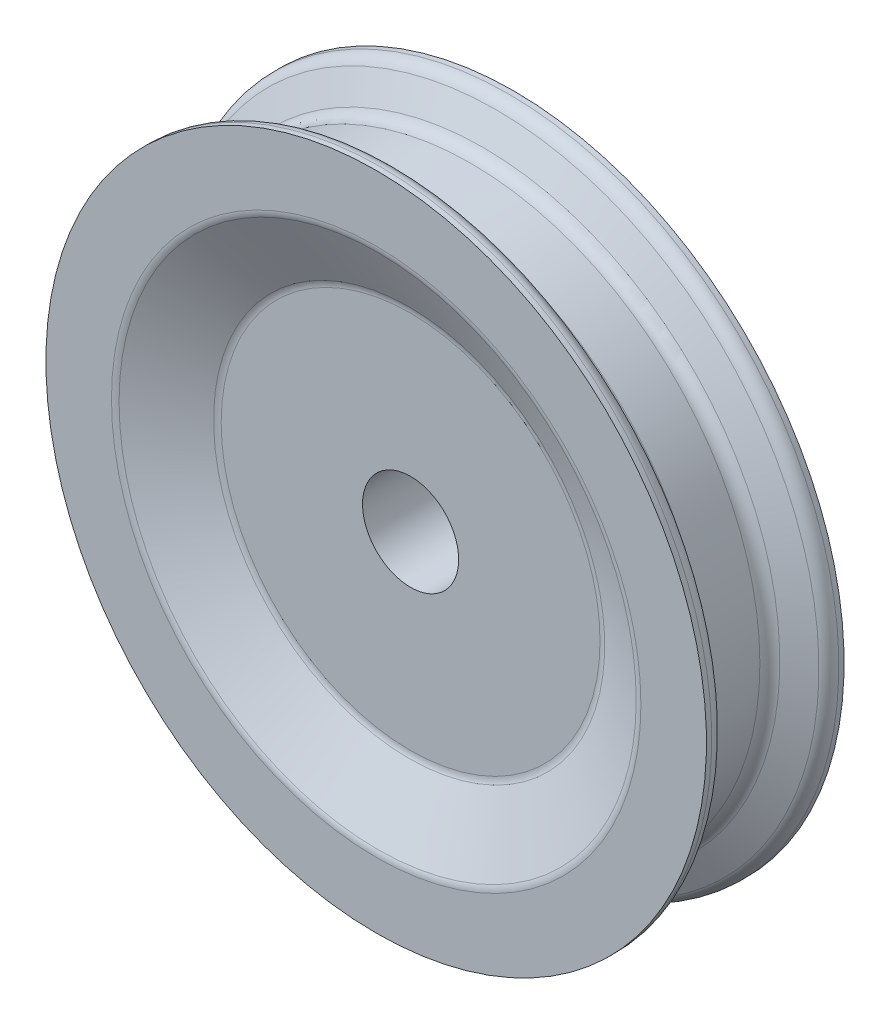
ISO-10303-21;
HEADER;
FILE_DESCRIPTION(('STEP AP214'),'2;1');
FILE_NAME('part.step','',(''),(''),'','','');
FILE_SCHEMA(('AUTOMOTIVE_DESIGN { 1 0 10303 214 1 1 1 1 }'));
ENDSEC;
DATA;
#1=APPLICATION_CONTEXT('core data for automotive mechanical design processes');
#2=APPLICATION_PROTOCOL_DEFINITION('international standard','automotive_design',2000,#1);
#3=PRODUCT_CONTEXT('',#1,'mechanical');
#4=PRODUCT('Part','Part','',(#3));
#5=PRODUCT_RELATED_PRODUCT_CATEGORY('part','',(#4));
#6=PRODUCT_DEFINITION_FORMATION('','',#4);
#7=PRODUCT_DEFINITION_CONTEXT('part definition',#1,'design');
#8=PRODUCT_DEFINITION('design','',#6,#7);
#9=PRODUCT_DEFINITION_SHAPE('','',#8);
#10=(LENGTH_UNIT() NAMED_UNIT(*) SI_UNIT(.MILLI.,.METRE.));
#11=(NAMED_UNIT(*) PLANE_ANGLE_UNIT() SI_UNIT($,.RADIAN.));
#12=(NAMED_UNIT(*) SI_UNIT($,.STERADIAN.) SOLID_ANGLE_UNIT());
#13=UNCERTAINTY_MEASURE_WITH_UNIT(LENGTH_MEASURE(1.E-05),#10,'distance_accuracy_value','');
#14=(GEOMETRIC_REPRESENTATION_CONTEXT(3) GLOBAL_UNCERTAINTY_ASSIGNED_CONTEXT((#13)) GLOBAL_UNIT_ASSIGNED_CONTEXT((#10,
#11,#12)) REPRESENTATION_CONTEXT('',''));
#15=CARTESIAN_POINT('',(0.,0.,0.));
#16=DIRECTION('',(0.,0.,1.));
#17=DIRECTION('',(1.,0.,0.));
#18=AXIS2_PLACEMENT_3D('',#15,#16,#17);
#19=CARTESIAN_POINT('',(0.,0.,12.5));
#20=DIRECTION('',(0.,0.,1.));
#21=DIRECTION('',(0.,-1.,0.));
#22=AXIS2_PLACEMENT_3D('',#19,#20,#21);
#23=CYLINDRICAL_SURFACE('',#22,120.);
#24=CARTESIAN_POINT('',(0.,0.,23.0901699437493));
#25=DIRECTION('',(0.,0.,-1.));
#26=DIRECTION('',(0.,1.,0.));
#27=AXIS2_PLACEMENT_3D('',#24,#25,#26);
#28=CIRCLE('',#27,120.);
#29=CARTESIAN_POINT('',(0.,120.,23.0901699437493));
#30=VERTEX_POINT('',#29);
#31=EDGE_CURVE('E39',#30,#30,#28,.F.);
#32=ORIENTED_EDGE('',*,*,#31,.T.);
#33=EDGE_LOOP('',(#32));
#34=FACE_BOUND('',#33,.T.);
#35=CARTESIAN_POINT('',(0.,0.,24.9999999999998));
#36=DIRECTION('',(0.,0.,1.));
#37=DIRECTION('',(0.,-1.,0.));
#38=AXIS2_PLACEMENT_3D('',#35,#36,#37);
#39=CIRCLE('',#38,120.);
#40=CARTESIAN_POINT('',(0.,-120.,24.9999999999998));
#41=VERTEX_POINT('',#40);
#42=EDGE_CURVE('E87',#41,#41,#39,.T.);
#43=ORIENTED_EDGE('',*,*,#42,.F.);
#44=EDGE_LOOP('',(#43));
#45=FACE_BOUND('',#44,.T.);
#46=ADVANCED_FACE('F31',(#34,#45),#23,.T.);
#47=CARTESIAN_POINT('',(0.,120.,24.9999999999998));
#48=DIRECTION('',(0.,0.,-1.));
#49=DIRECTION('',(0.,1.,0.));
#50=AXIS2_PLACEMENT_3D('',#47,#48,#49);
#51=PLANE('',#50);
#52=CARTESIAN_POINT('',(0.,0.,24.9999999999998));
#53=DIRECTION('',(0.,0.,-1.));
#54=DIRECTION('',(0.,1.,0.));
#55=AXIS2_PLACEMENT_3D('',#52,#53,#54);
#56=CIRCLE('',#55,96.1803398874989);
#57=CARTESIAN_POINT('',(0.,96.1803398874989,24.9999999999998));
#58=VERTEX_POINT('',#57);
#59=EDGE_CURVE('E78',#58,#58,#56,.T.);
#60=ORIENTED_EDGE('',*,*,#59,.T.);
#61=EDGE_LOOP('',(#60));
#62=FACE_BOUND('',#61,.T.);
#63=ORIENTED_EDGE('',*,*,#42,.T.);
#64=EDGE_LOOP('',(#63));
#65=FACE_BOUND('',#64,.T.);
#66=ADVANCED_FACE('F114',(#62,#65),#51,.F.);
#67=CARTESIAN_POINT('',(0.,0.,24.9999999999998));
#68=DIRECTION('',(0.,0.,1.));
#69=DIRECTION('',(0.,-1.,0.));
#70=AXIS2_PLACEMENT_3D('',#67,#68,#69);
#71=CONICAL_SURFACE('',#70,95.,1.1071487177941);
#72=CARTESIAN_POINT('',(0.,0.,24.4721359549994));
#73=DIRECTION('',(0.,0.,-1.));
#74=DIRECTION('',(0.,1.,0.));
#75=AXIS2_PLACEMENT_3D('',#72,#73,#74);
#76=CIRCLE('',#75,93.9442719099992);
#77=CARTESIAN_POINT('',(0.,93.9442719099992,24.4721359549994));
#78=VERTEX_POINT('',#77);
#79=EDGE_CURVE('E81',#78,#78,#76,.F.);
#80=ORIENTED_EDGE('',*,*,#79,.T.);
#81=EDGE_LOOP('',(#80));
#82=FACE_BOUND('',#81,.T.);
#83=CARTESIAN_POINT('',(0.,0.,13.0278640450004));
#84=DIRECTION('',(0.,0.,1.));
#85=DIRECTION('',(0.,-1.,0.));
#86=AXIS2_PLACEMENT_3D('',#83,#84,#85);
#87=CIRCLE('',#86,71.0557280900008);
#88=CARTESIAN_POINT('',(0.,-71.0557280900008,13.0278640450004));
#89=VERTEX_POINT('',#88);
#90=EDGE_CURVE('E84',#89,#89,#87,.F.);
#91=ORIENTED_EDGE('',*,*,#90,.T.);
#92=EDGE_LOOP('',(#91));
#93=FACE_BOUND('',#92,.T.);
#94=ADVANCED_FACE('F120',(#82,#93),#71,.F.);
#95=CARTESIAN_POINT('',(0.,70.,12.5));
#96=DIRECTION('',(0.,0.,-1.));
#97=DIRECTION('',(0.,1.,0.));
#98=AXIS2_PLACEMENT_3D('',#95,#96,#97);
#99=PLANE('',#98);
#100=CARTESIAN_POINT('',(0.,0.,12.5));
#101=DIRECTION('',(0.,0.,-1.));
#102=DIRECTION('',(0.,1.,0.));
#103=AXIS2_PLACEMENT_3D('',#100,#101,#102);
#104=CIRCLE('',#103,17.4625);
#105=CARTESIAN_POINT('',(0.,17.4625,12.5));
#106=VERTEX_POINT('',#105);
#107=EDGE_CURVE('E93',#106,#106,#104,.T.);
#108=ORIENTED_EDGE('',*,*,#107,.T.);
#109=EDGE_LOOP('',(#108));
#110=FACE_BOUND('',#109,.T.);
#111=CARTESIAN_POINT('',(0.,0.,12.5));
#112=DIRECTION('',(0.,0.,-1.));
#113=DIRECTION('',(0.,1.,0.));
#114=AXIS2_PLACEMENT_3D('',#111,#112,#113);
#115=CIRCLE('',#114,68.8196601125011);
#116=CARTESIAN_POINT('',(0.,68.8196601125011,12.5));
#117=VERTEX_POINT('',#116);
#118=EDGE_CURVE('E75',#117,#117,#115,.F.);
#119=ORIENTED_EDGE('',*,*,#118,.T.);
#120=EDGE_LOOP('',(#119));
#121=FACE_BOUND('',#120,.T.);
#122=ADVANCED_FACE('F184',(#110,#121),#99,.F.);
#123=CARTESIAN_POINT('',(0.,70.,-12.5));
#124=DIRECTION('',(0.,0.,1.));
#125=DIRECTION('',(0.,-1.,0.));
#126=AXIS2_PLACEMENT_3D('',#123,#124,#125);
#127=PLANE('',#126);
#128=CARTESIAN_POINT('',(0.,0.,-12.5));
#129=DIRECTION('',(0.,0.,1.));
#130=DIRECTION('',(0.,-1.,0.));
#131=AXIS2_PLACEMENT_3D('',#128,#129,#130);
#132=CIRCLE('',#131,17.4625);
#133=CARTESIAN_POINT('',(0.,-17.4625,-12.5));
#134=VERTEX_POINT('',#133);
#135=EDGE_CURVE('E35',#134,#134,#132,.T.);
#136=ORIENTED_EDGE('',*,*,#135,.T.);
#137=EDGE_LOOP('',(#136));
#138=FACE_BOUND('',#137,.T.);
#139=CARTESIAN_POINT('',(0.,0.,-12.5));
#140=DIRECTION('',(0.,0.,1.));
#141=DIRECTION('',(0.,-1.,0.));
#142=AXIS2_PLACEMENT_3D('',#139,#140,#141);
#143=CIRCLE('',#142,68.8196601125011);
#144=CARTESIAN_POINT('',(0.,-68.8196601125011,-12.5));
#145=VERTEX_POINT('',#144);
#146=EDGE_CURVE('E63',#145,#145,#143,.F.);
#147=ORIENTED_EDGE('',*,*,#146,.T.);
#148=EDGE_LOOP('',(#147));
#149=FACE_BOUND('',#148,.T.);
#150=ADVANCED_FACE('F100',(#138,#149),#127,.F.);
#151=CARTESIAN_POINT('',(0.,0.,-12.5));
#152=DIRECTION('',(0.,0.,-1.));
#153=DIRECTION('',(0.,1.,0.));
#154=AXIS2_PLACEMENT_3D('',#151,#152,#153);
#155=CONICAL_SURFACE('',#154,70.,1.10714871779408);
#156=CARTESIAN_POINT('',(0.,0.,-24.4721359549998));
#157=DIRECTION('',(0.,0.,1.));
#158=DIRECTION('',(0.,-1.,0.));
#159=AXIS2_PLACEMENT_3D('',#156,#157,#158);
#160=CIRCLE('',#159,93.9442719099991);
#161=CARTESIAN_POINT('',(0.,-93.9442719099991,-24.4721359549998));
#162=VERTEX_POINT('',#161);
#163=EDGE_CURVE('E66',#162,#162,#160,.F.);
#164=ORIENTED_EDGE('',*,*,#163,.T.);
#165=EDGE_LOOP('',(#164));
#166=FACE_BOUND('',#165,.T.);
#167=CARTESIAN_POINT('',(0.,0.,-13.0278640450004));
#168=DIRECTION('',(0.,0.,-1.));
#169=DIRECTION('',(0.,1.,0.));
#170=AXIS2_PLACEMENT_3D('',#167,#168,#169);
#171=CIRCLE('',#170,71.0557280900009);
#172=CARTESIAN_POINT('',(0.,71.0557280900009,-13.0278640450004));
#173=VERTEX_POINT('',#172);
#174=EDGE_CURVE('E69',#173,#173,#171,.F.);
#175=ORIENTED_EDGE('',*,*,#174,.T.);
#176=EDGE_LOOP('',(#175));
#177=FACE_BOUND('',#176,.T.);
#178=ADVANCED_FACE('F177',(#166,#177),#155,.F.);
#179=CARTESIAN_POINT('',(0.,95.,-25.0000000000002));
#180=DIRECTION('',(0.,0.,1.));
#181=DIRECTION('',(0.,-1.,0.));
#182=AXIS2_PLACEMENT_3D('',#179,#180,#181);
#183=PLANE('',#182);
#184=CARTESIAN_POINT('',(0.,0.,-25.0000000000002));
#185=DIRECTION('',(0.,0.,1.));
#186=DIRECTION('',(0.,-1.,0.));
#187=AXIS2_PLACEMENT_3D('',#184,#185,#186);
#188=CIRCLE('',#187,96.180339887499);
#189=CARTESIAN_POINT('',(0.,-96.180339887499,-25.0000000000002));
#190=VERTEX_POINT('',#189);
#191=EDGE_CURVE('E72',#190,#190,#188,.T.);
#192=ORIENTED_EDGE('',*,*,#191,.T.);
#193=EDGE_LOOP('',(#192));
#194=FACE_BOUND('',#193,.T.);
#195=CARTESIAN_POINT('',(0.,0.,-25.0000000000002));
#196=DIRECTION('',(0.,0.,1.));
#197=DIRECTION('',(0.,-1.,0.));
#198=AXIS2_PLACEMENT_3D('',#195,#196,#197);
#199=CIRCLE('',#198,120.);
#200=CARTESIAN_POINT('',(0.,-120.,-25.0000000000002));
#201=VERTEX_POINT('',#200);
#202=EDGE_CURVE('E90',#201,#201,#199,.T.);
#203=ORIENTED_EDGE('',*,*,#202,.F.);
#204=EDGE_LOOP('',(#203));
#205=FACE_BOUND('',#204,.T.);
#206=ADVANCED_FACE('F174',(#194,#205),#183,.F.);
#207=CARTESIAN_POINT('',(0.,0.,12.5));
#208=DIRECTION('',(0.,0.,1.));
#209=DIRECTION('',(0.,-1.,0.));
#210=AXIS2_PLACEMENT_3D('',#207,#208,#209);
#211=CYLINDRICAL_SURFACE('',#210,120.);
#212=CARTESIAN_POINT('',(0.,0.,-23.0901699437496));
#213=DIRECTION('',(0.,0.,-1.));
#214=DIRECTION('',(0.,1.,0.));
#215=AXIS2_PLACEMENT_3D('',#212,#213,#214);
#216=CIRCLE('',#215,120.);
#217=CARTESIAN_POINT('',(0.,120.,-23.0901699437496));
#218=VERTEX_POINT('',#217);
#219=EDGE_CURVE('E10',#218,#218,#216,.T.);
#220=ORIENTED_EDGE('',*,*,#219,.T.);
#221=EDGE_LOOP('',(#220));
#222=FACE_BOUND('',#221,.T.);
#223=ORIENTED_EDGE('',*,*,#202,.T.);
#224=EDGE_LOOP('',(#223));
#225=FACE_BOUND('',#224,.T.);
#226=ADVANCED_FACE('F170',(#222,#225),#211,.T.);
#227=CARTESIAN_POINT('',(0.,0.,-20.0000000000002));
#228=DIRECTION('',(0.,0.,-1.));
#229=DIRECTION('',(0.,1.,0.));
#230=AXIS2_PLACEMENT_3D('',#227,#228,#229);
#231=CONICAL_SURFACE('',#230,120.,1.10714871779408);
#232=CARTESIAN_POINT('',(0.,0.,-13.8819660112501));
#233=DIRECTION('',(0.,0.,-1.));
#234=DIRECTION('',(0.,1.,0.));
#235=AXIS2_PLACEMENT_3D('',#232,#233,#234);
#236=CIRCLE('',#235,107.7639320225);
#237=CARTESIAN_POINT('',(0.,107.7639320225,-13.8819660112501));
#238=VERTEX_POINT('',#237);
#239=EDGE_CURVE('E43',#238,#238,#236,.T.);
#240=ORIENTED_EDGE('',*,*,#239,.T.);
#241=EDGE_LOOP('',(#240));
#242=FACE_BOUND('',#241,.T.);
#243=CARTESIAN_POINT('',(0.,0.,-18.6180339887501));
#244=DIRECTION('',(0.,0.,1.));
#245=DIRECTION('',(0.,-1.,0.));
#246=AXIS2_PLACEMENT_3D('',#243,#244,#245);
#247=CIRCLE('',#246,117.2360679775);
#248=CARTESIAN_POINT('',(0.,-117.2360679775,-18.6180339887501));
#249=VERTEX_POINT('',#248);
#250=EDGE_CURVE('E48',#249,#249,#247,.T.);
#251=ORIENTED_EDGE('',*,*,#250,.T.);
#252=EDGE_LOOP('',(#251));
#253=FACE_BOUND('',#252,.T.);
#254=ADVANCED_FACE('F164',(#242,#253),#231,.T.);
#255=CARTESIAN_POINT('',(0.,0.,12.5));
#256=DIRECTION('',(0.,0.,1.));
#257=DIRECTION('',(0.,-1.,0.));
#258=AXIS2_PLACEMENT_3D('',#255,#256,#257);
#259=CYLINDRICAL_SURFACE('',#258,105.);
#260=CARTESIAN_POINT('',(0.,0.,9.40983005625048));
#261=DIRECTION('',(0.,0.,1.));
#262=DIRECTION('',(0.,-1.,0.));
#263=AXIS2_PLACEMENT_3D('',#260,#261,#262);
#264=CIRCLE('',#263,105.);
#265=CARTESIAN_POINT('',(0.,-105.,9.40983005625047));
#266=VERTEX_POINT('',#265);
#267=EDGE_CURVE('E51',#266,#266,#264,.F.);
#268=ORIENTED_EDGE('',*,*,#267,.T.);
#269=EDGE_LOOP('',(#268));
#270=FACE_BOUND('',#269,.T.);
#271=CARTESIAN_POINT('',(0.,0.,-9.40983005625058));
#272=DIRECTION('',(0.,0.,1.));
#273=DIRECTION('',(0.,-1.,0.));
#274=AXIS2_PLACEMENT_3D('',#271,#272,#273);
#275=CIRCLE('',#274,105.);
#276=CARTESIAN_POINT('',(0.,-105.,-9.40983005625059));
#277=VERTEX_POINT('',#276);
#278=EDGE_CURVE('E54',#277,#277,#275,.T.);
#279=ORIENTED_EDGE('',*,*,#278,.T.);
#280=EDGE_LOOP('',(#279));
#281=FACE_BOUND('',#280,.T.);
#282=ADVANCED_FACE('F159',(#270,#281),#259,.T.);
#283=CARTESIAN_POINT('',(0.,0.,12.5));
#284=DIRECTION('',(0.,0.,1.));
#285=DIRECTION('',(0.,-1.,0.));
#286=AXIS2_PLACEMENT_3D('',#283,#284,#285);
#287=CONICAL_SURFACE('',#286,105.,1.1071487177941);
#288=CARTESIAN_POINT('',(0.,0.,13.8819660112501));
#289=DIRECTION('',(0.,0.,1.));
#290=DIRECTION('',(0.,-1.,0.));
#291=AXIS2_PLACEMENT_3D('',#288,#289,#290);
#292=CIRCLE('',#291,107.7639320225);
#293=CARTESIAN_POINT('',(0.,-107.7639320225,13.8819660112501));
#294=VERTEX_POINT('',#293);
#295=EDGE_CURVE('E57',#294,#294,#292,.T.);
#296=ORIENTED_EDGE('',*,*,#295,.T.);
#297=EDGE_LOOP('',(#296));
#298=FACE_BOUND('',#297,.T.);
#299=CARTESIAN_POINT('',(0.,0.,18.6180339887497));
#300=DIRECTION('',(0.,0.,-1.));
#301=DIRECTION('',(0.,1.,0.));
#302=AXIS2_PLACEMENT_3D('',#299,#300,#301);
#303=CIRCLE('',#302,117.2360679775);
#304=CARTESIAN_POINT('',(0.,117.2360679775,18.6180339887497));
#305=VERTEX_POINT('',#304);
#306=EDGE_CURVE('E60',#305,#305,#303,.T.);
#307=ORIENTED_EDGE('',*,*,#306,.T.);
#308=EDGE_LOOP('',(#307));
#309=FACE_BOUND('',#308,.T.);
#310=ADVANCED_FACE('F130',(#298,#309),#287,.T.);
#311=CARTESIAN_POINT('',(0.,0.,19.9999999999998));
#312=DIRECTION('',(0.,0.,-1.));
#313=DIRECTION('',(0.,1.,0.));
#314=AXIS2_PLACEMENT_3D('',#311,#312,#313);
#315=TOROIDAL_SURFACE('',#314,96.1803398874989,5.);
#316=ORIENTED_EDGE('',*,*,#59,.F.);
#317=EDGE_LOOP('',(#316));
#318=FACE_BOUND('',#317,.T.);
#319=ORIENTED_EDGE('',*,*,#79,.F.);
#320=EDGE_LOOP('',(#319));
#321=FACE_BOUND('',#320,.T.);
#322=ADVANCED_FACE('F126',(#318,#321),#315,.T.);
#323=CARTESIAN_POINT('',(0.,0.,17.5));
#324=DIRECTION('',(0.,0.,-1.));
#325=DIRECTION('',(0.,1.,0.));
#326=AXIS2_PLACEMENT_3D('',#323,#324,#325);
#327=TOROIDAL_SURFACE('',#326,68.8196601125011,5.);
#328=ORIENTED_EDGE('',*,*,#90,.F.);
#329=EDGE_LOOP('',(#328));
#330=FACE_BOUND('',#329,.T.);
#331=ORIENTED_EDGE('',*,*,#118,.F.);
#332=EDGE_LOOP('',(#331));
#333=FACE_BOUND('',#332,.T.);
#334=ADVANCED_FACE('F129',(#330,#333),#327,.F.);
#335=CARTESIAN_POINT('',(0.,0.,-20.0000000000002));
#336=DIRECTION('',(0.,0.,1.));
#337=DIRECTION('',(0.,-1.,0.));
#338=AXIS2_PLACEMENT_3D('',#335,#336,#337);
#339=TOROIDAL_SURFACE('',#338,96.180339887499,5.);
#340=ORIENTED_EDGE('',*,*,#163,.F.);
#341=EDGE_LOOP('',(#340));
#342=FACE_BOUND('',#341,.T.);
#343=ORIENTED_EDGE('',*,*,#191,.F.);
#344=EDGE_LOOP('',(#343));
#345=FACE_BOUND('',#344,.T.);
#346=ADVANCED_FACE('F134',(#342,#345),#339,.T.);
#347=CARTESIAN_POINT('',(0.,0.,-17.5));
#348=DIRECTION('',(0.,0.,1.));
#349=DIRECTION('',(0.,-1.,0.));
#350=AXIS2_PLACEMENT_3D('',#347,#348,#349);
#351=TOROIDAL_SURFACE('',#350,68.8196601125011,5.);
#352=ORIENTED_EDGE('',*,*,#146,.F.);
#353=EDGE_LOOP('',(#352));
#354=FACE_BOUND('',#353,.T.);
#355=ORIENTED_EDGE('',*,*,#174,.F.);
#356=EDGE_LOOP('',(#355));
#357=FACE_BOUND('',#356,.T.);
#358=ADVANCED_FACE('F138',(#354,#357),#351,.F.);
#359=CARTESIAN_POINT('',(0.,0.,9.40983005625048));
#360=DIRECTION('',(0.,0.,1.));
#361=DIRECTION('',(0.,-1.,0.));
#362=AXIS2_PLACEMENT_3D('',#359,#360,#361);
#363=TOROIDAL_SURFACE('',#362,110.,5.);
#364=ORIENTED_EDGE('',*,*,#267,.F.);
#365=EDGE_LOOP('',(#364));
#366=FACE_BOUND('',#365,.T.);
#367=ORIENTED_EDGE('',*,*,#295,.F.);
#368=EDGE_LOOP('',(#367));
#369=FACE_BOUND('',#368,.T.);
#370=ADVANCED_FACE('F142',(#366,#369),#363,.F.);
#371=CARTESIAN_POINT('',(0.,0.,-9.40983005625058));
#372=DIRECTION('',(0.,0.,1.));
#373=DIRECTION('',(0.,-1.,0.));
#374=AXIS2_PLACEMENT_3D('',#371,#372,#373);
#375=TOROIDAL_SURFACE('',#374,110.,5.);
#376=ORIENTED_EDGE('',*,*,#239,.F.);
#377=EDGE_LOOP('',(#376));
#378=FACE_BOUND('',#377,.T.);
#379=ORIENTED_EDGE('',*,*,#278,.F.);
#380=EDGE_LOOP('',(#379));
#381=FACE_BOUND('',#380,.T.);
#382=ADVANCED_FACE('F146',(#378,#381),#375,.F.);
#383=CARTESIAN_POINT('',(0.,0.,23.0901699437493));
#384=DIRECTION('',(0.,0.,-1.));
#385=DIRECTION('',(0.,1.,0.));
#386=AXIS2_PLACEMENT_3D('',#383,#384,#385);
#387=TOROIDAL_SURFACE('',#386,115.,5.);
#388=ORIENTED_EDGE('',*,*,#306,.F.);
#389=EDGE_LOOP('',(#388));
#390=FACE_BOUND('',#389,.T.);
#391=ORIENTED_EDGE('',*,*,#31,.F.);
#392=EDGE_LOOP('',(#391));
#393=FACE_BOUND('',#392,.T.);
#394=ADVANCED_FACE('F110',(#390,#393),#387,.T.);
#395=CARTESIAN_POINT('',(0.,0.,-23.0901699437496));
#396=DIRECTION('',(0.,0.,-1.));
#397=DIRECTION('',(0.,1.,0.));
#398=AXIS2_PLACEMENT_3D('',#395,#396,#397);
#399=TOROIDAL_SURFACE('',#398,115.,5.);
#400=ORIENTED_EDGE('',*,*,#219,.F.);
#401=EDGE_LOOP('',(#400));
#402=FACE_BOUND('',#401,.T.);
#403=ORIENTED_EDGE('',*,*,#250,.F.);
#404=EDGE_LOOP('',(#403));
#405=FACE_BOUND('',#404,.T.);
#406=ADVANCED_FACE('F33',(#402,#405),#399,.T.);
#407=CARTESIAN_POINT('',(0.,0.,24.9999999999998));
#408=DIRECTION('',(0.,0.,-1.));
#409=DIRECTION('',(0.,1.,0.));
#410=AXIS2_PLACEMENT_3D('',#407,#408,#409);
#411=CYLINDRICAL_SURFACE('',#410,17.4625);
#412=ORIENTED_EDGE('',*,*,#135,.F.);
#413=EDGE_LOOP('',(#412));
#414=FACE_BOUND('',#413,.T.);
#415=ORIENTED_EDGE('',*,*,#107,.F.);
#416=EDGE_LOOP('',(#415));
#417=FACE_BOUND('',#416,.T.);
#418=ADVANCED_FACE('F103',(#414,#417),#411,.F.);
#419=CLOSED_SHELL('',(#46,#66,#94,#122,#150,#178,#206,#226,#254,#282,#310,#322,#334,#346,#358,
#370,#382,#394,#406,#418));
#420=MANIFOLD_SOLID_BREP('B2',#419);
#421=ADVANCED_BREP_SHAPE_REPRESENTATION('',(#18,#420),#14);
#422=SHAPE_DEFINITION_REPRESENTATION(#9,#421);
ENDSEC;
END-ISO-10303-21;
